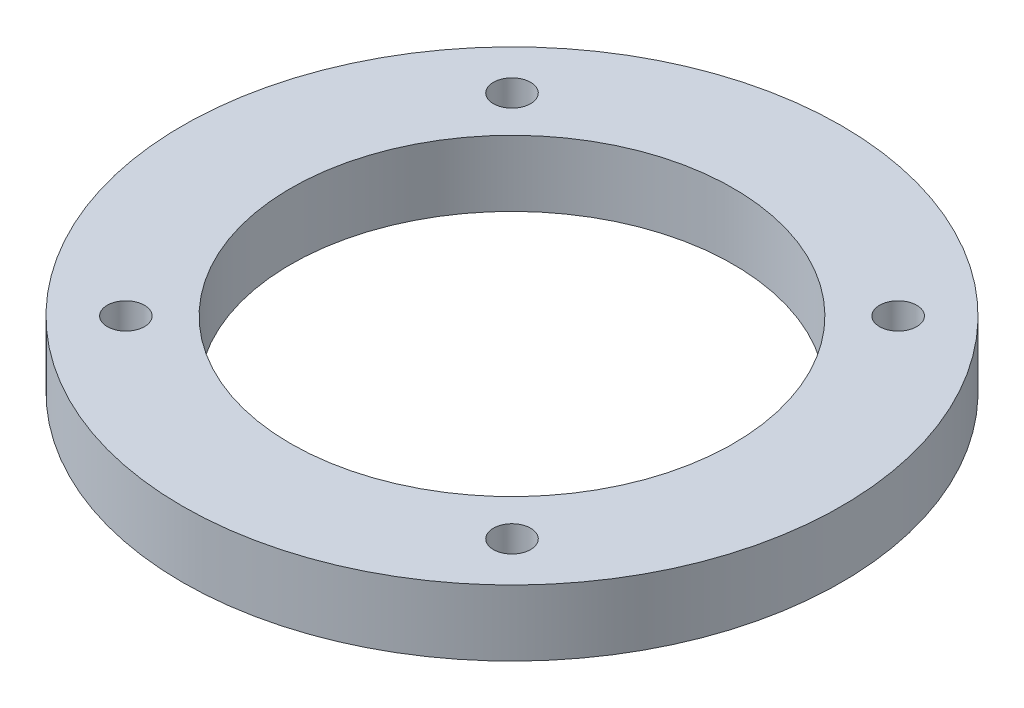
ISO-10303-21;
HEADER;
FILE_DESCRIPTION(('STEP AP214'),'2;1');
FILE_NAME('part.step','',(''),(''),'','','');
FILE_SCHEMA(('AUTOMOTIVE_DESIGN { 1 0 10303 214 1 1 1 1 }'));
ENDSEC;
DATA;
#1=APPLICATION_CONTEXT('core data for automotive mechanical design processes');
#2=APPLICATION_PROTOCOL_DEFINITION('international standard','automotive_design',2000,#1);
#3=PRODUCT_CONTEXT('',#1,'mechanical');
#4=PRODUCT('Part','Part','',(#3));
#5=PRODUCT_RELATED_PRODUCT_CATEGORY('part','',(#4));
#6=PRODUCT_DEFINITION_FORMATION('','',#4);
#7=PRODUCT_DEFINITION_CONTEXT('part definition',#1,'design');
#8=PRODUCT_DEFINITION('design','',#6,#7);
#9=PRODUCT_DEFINITION_SHAPE('','',#8);
#10=(LENGTH_UNIT() NAMED_UNIT(*) SI_UNIT(.MILLI.,.METRE.));
#11=(NAMED_UNIT(*) PLANE_ANGLE_UNIT() SI_UNIT($,.RADIAN.));
#12=(NAMED_UNIT(*) SI_UNIT($,.STERADIAN.) SOLID_ANGLE_UNIT());
#13=UNCERTAINTY_MEASURE_WITH_UNIT(LENGTH_MEASURE(1.E-05),#10,'distance_accuracy_value','');
#14=(GEOMETRIC_REPRESENTATION_CONTEXT(3) GLOBAL_UNCERTAINTY_ASSIGNED_CONTEXT((#13)) GLOBAL_UNIT_ASSIGNED_CONTEXT((#10,
#11,#12)) REPRESENTATION_CONTEXT('',''));
#15=CARTESIAN_POINT('',(0.,0.,0.));
#16=DIRECTION('',(0.,0.,1.));
#17=DIRECTION('',(1.,0.,0.));
#18=AXIS2_PLACEMENT_3D('',#15,#16,#17);
#19=CARTESIAN_POINT('',(0.,7.,0.));
#20=DIRECTION('',(0.,1.,0.));
#21=DIRECTION('',(0.,0.,1.));
#22=AXIS2_PLACEMENT_3D('',#19,#20,#21);
#23=PLANE('',#22);
#24=CARTESIAN_POINT('',(20.505,7.,20.505));
#25=DIRECTION('',(0.,1.,0.));
#26=DIRECTION('',(0.,0.,-1.));
#27=AXIS2_PLACEMENT_3D('',#24,#25,#26);
#28=CIRCLE('',#27,1.975);
#29=CARTESIAN_POINT('',(20.505,7.,18.53));
#30=VERTEX_POINT('',#29);
#31=EDGE_CURVE('E63',#30,#30,#28,.T.);
#32=ORIENTED_EDGE('',*,*,#31,.F.);
#33=EDGE_LOOP('',(#32));
#34=FACE_BOUND('',#33,.T.);
#35=CARTESIAN_POINT('',(20.505,7.,-20.505));
#36=DIRECTION('',(0.,1.,0.));
#37=DIRECTION('',(0.,0.,1.));
#38=AXIS2_PLACEMENT_3D('',#35,#36,#37);
#39=CIRCLE('',#38,1.975);
#40=CARTESIAN_POINT('',(20.505,7.,-18.53));
#41=VERTEX_POINT('',#40);
#42=EDGE_CURVE('E51',#41,#41,#39,.T.);
#43=ORIENTED_EDGE('',*,*,#42,.F.);
#44=EDGE_LOOP('',(#43));
#45=FACE_BOUND('',#44,.T.);
#46=CARTESIAN_POINT('',(0.,7.,0.));
#47=DIRECTION('',(0.,1.,0.));
#48=DIRECTION('',(0.,0.,1.));
#49=AXIS2_PLACEMENT_3D('',#46,#47,#48);
#50=CIRCLE('',#49,35.);
#51=CARTESIAN_POINT('',(0.,7.,35.));
#52=VERTEX_POINT('',#51);
#53=EDGE_CURVE('E10',#52,#52,#50,.T.);
#54=ORIENTED_EDGE('',*,*,#53,.T.);
#55=EDGE_LOOP('',(#54));
#56=FACE_BOUND('',#55,.T.);
#57=CARTESIAN_POINT('',(0.,7.,0.));
#58=DIRECTION('',(0.,1.,0.));
#59=DIRECTION('',(0.,0.,1.));
#60=AXIS2_PLACEMENT_3D('',#57,#58,#59);
#61=CIRCLE('',#60,23.5);
#62=CARTESIAN_POINT('',(0.,7.,23.5));
#63=VERTEX_POINT('',#62);
#64=EDGE_CURVE('E46',#63,#63,#61,.T.);
#65=ORIENTED_EDGE('',*,*,#64,.F.);
#66=EDGE_LOOP('',(#65));
#67=FACE_BOUND('',#66,.T.);
#68=CARTESIAN_POINT('',(-20.505,7.,-20.505));
#69=DIRECTION('',(0.,1.,0.));
#70=DIRECTION('',(0.,0.,-1.));
#71=AXIS2_PLACEMENT_3D('',#68,#69,#70);
#72=CIRCLE('',#71,1.975);
#73=CARTESIAN_POINT('',(-20.505,7.,-22.48));
#74=VERTEX_POINT('',#73);
#75=EDGE_CURVE('E57',#74,#74,#72,.T.);
#76=ORIENTED_EDGE('',*,*,#75,.F.);
#77=EDGE_LOOP('',(#76));
#78=FACE_BOUND('',#77,.T.);
#79=CARTESIAN_POINT('',(-20.505,7.,20.505));
#80=DIRECTION('',(0.,1.,0.));
#81=DIRECTION('',(0.,0.,1.));
#82=AXIS2_PLACEMENT_3D('',#79,#80,#81);
#83=CIRCLE('',#82,1.975);
#84=CARTESIAN_POINT('',(-20.505,7.,22.48));
#85=VERTEX_POINT('',#84);
#86=EDGE_CURVE('E69',#85,#85,#83,.T.);
#87=ORIENTED_EDGE('',*,*,#86,.F.);
#88=EDGE_LOOP('',(#87));
#89=FACE_BOUND('',#88,.T.);
#90=ADVANCED_FACE('F35',(#34,#45,#56,#67,#78,#89),#23,.T.);
#91=CARTESIAN_POINT('',(0.,0.,0.));
#92=DIRECTION('',(0.,1.,0.));
#93=DIRECTION('',(0.,0.,1.));
#94=AXIS2_PLACEMENT_3D('',#91,#92,#93);
#95=PLANE('',#94);
#96=CARTESIAN_POINT('',(0.,0.,0.));
#97=DIRECTION('',(0.,1.,0.));
#98=DIRECTION('',(0.,0.,1.));
#99=AXIS2_PLACEMENT_3D('',#96,#97,#98);
#100=CIRCLE('',#99,35.);
#101=CARTESIAN_POINT('',(0.,0.,35.));
#102=VERTEX_POINT('',#101);
#103=EDGE_CURVE('E39',#102,#102,#100,.T.);
#104=ORIENTED_EDGE('',*,*,#103,.F.);
#105=EDGE_LOOP('',(#104));
#106=FACE_BOUND('',#105,.T.);
#107=CARTESIAN_POINT('',(0.,0.,0.));
#108=DIRECTION('',(0.,1.,0.));
#109=DIRECTION('',(0.,0.,1.));
#110=AXIS2_PLACEMENT_3D('',#107,#108,#109);
#111=CIRCLE('',#110,23.5);
#112=CARTESIAN_POINT('',(0.,0.,23.5));
#113=VERTEX_POINT('',#112);
#114=EDGE_CURVE('E48',#113,#113,#111,.T.);
#115=ORIENTED_EDGE('',*,*,#114,.T.);
#116=EDGE_LOOP('',(#115));
#117=FACE_BOUND('',#116,.T.);
#118=CARTESIAN_POINT('',(20.505,0.,-20.505));
#119=DIRECTION('',(0.,1.,0.));
#120=DIRECTION('',(0.,0.,1.));
#121=AXIS2_PLACEMENT_3D('',#118,#119,#120);
#122=CIRCLE('',#121,1.975);
#123=CARTESIAN_POINT('',(20.505,0.,-18.53));
#124=VERTEX_POINT('',#123);
#125=EDGE_CURVE('E54',#124,#124,#122,.T.);
#126=ORIENTED_EDGE('',*,*,#125,.T.);
#127=EDGE_LOOP('',(#126));
#128=FACE_BOUND('',#127,.T.);
#129=CARTESIAN_POINT('',(-20.505,0.,-20.505));
#130=DIRECTION('',(0.,1.,0.));
#131=DIRECTION('',(0.,0.,-1.));
#132=AXIS2_PLACEMENT_3D('',#129,#130,#131);
#133=CIRCLE('',#132,1.975);
#134=CARTESIAN_POINT('',(-20.505,0.,-22.48));
#135=VERTEX_POINT('',#134);
#136=EDGE_CURVE('E60',#135,#135,#133,.T.);
#137=ORIENTED_EDGE('',*,*,#136,.T.);
#138=EDGE_LOOP('',(#137));
#139=FACE_BOUND('',#138,.T.);
#140=CARTESIAN_POINT('',(20.505,0.,20.505));
#141=DIRECTION('',(0.,1.,0.));
#142=DIRECTION('',(0.,0.,-1.));
#143=AXIS2_PLACEMENT_3D('',#140,#141,#142);
#144=CIRCLE('',#143,1.975);
#145=CARTESIAN_POINT('',(20.505,0.,18.53));
#146=VERTEX_POINT('',#145);
#147=EDGE_CURVE('E66',#146,#146,#144,.T.);
#148=ORIENTED_EDGE('',*,*,#147,.T.);
#149=EDGE_LOOP('',(#148));
#150=FACE_BOUND('',#149,.T.);
#151=CARTESIAN_POINT('',(-20.505,0.,20.505));
#152=DIRECTION('',(0.,1.,0.));
#153=DIRECTION('',(0.,0.,1.));
#154=AXIS2_PLACEMENT_3D('',#151,#152,#153);
#155=CIRCLE('',#154,1.975);
#156=CARTESIAN_POINT('',(-20.505,0.,22.48));
#157=VERTEX_POINT('',#156);
#158=EDGE_CURVE('E72',#157,#157,#155,.T.);
#159=ORIENTED_EDGE('',*,*,#158,.T.);
#160=EDGE_LOOP('',(#159));
#161=FACE_BOUND('',#160,.T.);
#162=ADVANCED_FACE('F82',(#106,#117,#128,#139,#150,#161),#95,.F.);
#163=CARTESIAN_POINT('',(0.,7.,0.));
#164=DIRECTION('',(0.,-1.,0.));
#165=DIRECTION('',(0.,0.,-1.));
#166=AXIS2_PLACEMENT_3D('',#163,#164,#165);
#167=CYLINDRICAL_SURFACE('',#166,35.);
#168=ORIENTED_EDGE('',*,*,#53,.F.);
#169=EDGE_LOOP('',(#168));
#170=FACE_BOUND('',#169,.T.);
#171=ORIENTED_EDGE('',*,*,#103,.T.);
#172=EDGE_LOOP('',(#171));
#173=FACE_BOUND('',#172,.T.);
#174=ADVANCED_FACE('F37',(#170,#173),#167,.T.);
#175=CARTESIAN_POINT('',(0.,7.,0.));
#176=DIRECTION('',(0.,-1.,0.));
#177=DIRECTION('',(0.,0.,-1.));
#178=AXIS2_PLACEMENT_3D('',#175,#176,#177);
#179=CYLINDRICAL_SURFACE('',#178,23.5);
#180=ORIENTED_EDGE('',*,*,#64,.T.);
#181=EDGE_LOOP('',(#180));
#182=FACE_BOUND('',#181,.T.);
#183=ORIENTED_EDGE('',*,*,#114,.F.);
#184=EDGE_LOOP('',(#183));
#185=FACE_BOUND('',#184,.T.);
#186=ADVANCED_FACE('F92',(#182,#185),#179,.F.);
#187=CARTESIAN_POINT('',(20.505,7.,-20.505));
#188=DIRECTION('',(0.,-1.,0.));
#189=DIRECTION('',(0.,0.,-1.));
#190=AXIS2_PLACEMENT_3D('',#187,#188,#189);
#191=CYLINDRICAL_SURFACE('',#190,1.975);
#192=ORIENTED_EDGE('',*,*,#42,.T.);
#193=EDGE_LOOP('',(#192));
#194=FACE_BOUND('',#193,.T.);
#195=ORIENTED_EDGE('',*,*,#125,.F.);
#196=EDGE_LOOP('',(#195));
#197=FACE_BOUND('',#196,.T.);
#198=ADVANCED_FACE('F95',(#194,#197),#191,.F.);
#199=CARTESIAN_POINT('',(-20.505,7.,-20.505));
#200=DIRECTION('',(0.,-1.,0.));
#201=DIRECTION('',(0.,0.,-1.));
#202=AXIS2_PLACEMENT_3D('',#199,#200,#201);
#203=CYLINDRICAL_SURFACE('',#202,1.975);
#204=ORIENTED_EDGE('',*,*,#75,.T.);
#205=EDGE_LOOP('',(#204));
#206=FACE_BOUND('',#205,.T.);
#207=ORIENTED_EDGE('',*,*,#136,.F.);
#208=EDGE_LOOP('',(#207));
#209=FACE_BOUND('',#208,.T.);
#210=ADVANCED_FACE('F99',(#206,#209),#203,.F.);
#211=CARTESIAN_POINT('',(20.505,7.,20.505));
#212=DIRECTION('',(0.,-1.,0.));
#213=DIRECTION('',(0.,0.,-1.));
#214=AXIS2_PLACEMENT_3D('',#211,#212,#213);
#215=CYLINDRICAL_SURFACE('',#214,1.975);
#216=ORIENTED_EDGE('',*,*,#31,.T.);
#217=EDGE_LOOP('',(#216));
#218=FACE_BOUND('',#217,.T.);
#219=ORIENTED_EDGE('',*,*,#147,.F.);
#220=EDGE_LOOP('',(#219));
#221=FACE_BOUND('',#220,.T.);
#222=ADVANCED_FACE('F103',(#218,#221),#215,.F.);
#223=CARTESIAN_POINT('',(-20.505,7.,20.505));
#224=DIRECTION('',(0.,-1.,0.));
#225=DIRECTION('',(0.,0.,-1.));
#226=AXIS2_PLACEMENT_3D('',#223,#224,#225);
#227=CYLINDRICAL_SURFACE('',#226,1.975);
#228=ORIENTED_EDGE('',*,*,#86,.T.);
#229=EDGE_LOOP('',(#228));
#230=FACE_BOUND('',#229,.T.);
#231=ORIENTED_EDGE('',*,*,#158,.F.);
#232=EDGE_LOOP('',(#231));
#233=FACE_BOUND('',#232,.T.);
#234=ADVANCED_FACE('F78',(#230,#233),#227,.F.);
#235=CLOSED_SHELL('',(#90,#162,#174,#186,#198,#210,#222,#234));
#236=MANIFOLD_SOLID_BREP('B2',#235);
#237=ADVANCED_BREP_SHAPE_REPRESENTATION('',(#18,#236),#14);
#238=SHAPE_DEFINITION_REPRESENTATION(#9,#237);
ENDSEC;
END-ISO-10303-21;
